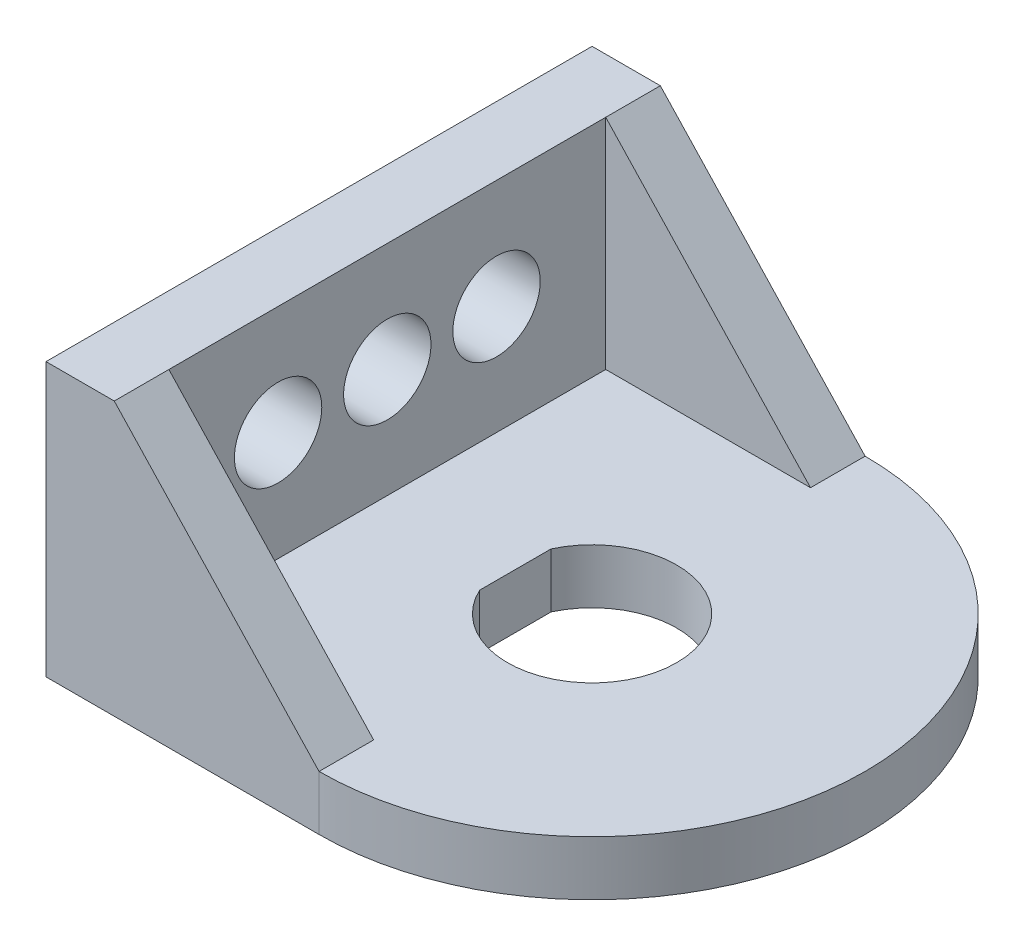
ISO-10303-21;
HEADER;
FILE_DESCRIPTION(('STEP AP214'),'2;1');
FILE_NAME('part.step','',(''),(''),'','','');
FILE_SCHEMA(('AUTOMOTIVE_DESIGN { 1 0 10303 214 1 1 1 1 }'));
ENDSEC;
DATA;
#1=APPLICATION_CONTEXT('core data for automotive mechanical design processes');
#2=APPLICATION_PROTOCOL_DEFINITION('international standard','automotive_design',2000,#1);
#3=PRODUCT_CONTEXT('',#1,'mechanical');
#4=PRODUCT('Part','Part','',(#3));
#5=PRODUCT_RELATED_PRODUCT_CATEGORY('part','',(#4));
#6=PRODUCT_DEFINITION_FORMATION('','',#4);
#7=PRODUCT_DEFINITION_CONTEXT('part definition',#1,'design');
#8=PRODUCT_DEFINITION('design','',#6,#7);
#9=PRODUCT_DEFINITION_SHAPE('','',#8);
#10=(LENGTH_UNIT() NAMED_UNIT(*) SI_UNIT(.MILLI.,.METRE.));
#11=(NAMED_UNIT(*) PLANE_ANGLE_UNIT() SI_UNIT($,.RADIAN.));
#12=(NAMED_UNIT(*) SI_UNIT($,.STERADIAN.) SOLID_ANGLE_UNIT());
#13=UNCERTAINTY_MEASURE_WITH_UNIT(LENGTH_MEASURE(1.E-05),#10,'distance_accuracy_value','');
#14=(GEOMETRIC_REPRESENTATION_CONTEXT(3) GLOBAL_UNCERTAINTY_ASSIGNED_CONTEXT((#13)) GLOBAL_UNIT_ASSIGNED_CONTEXT((#10,
#11,#12)) REPRESENTATION_CONTEXT('',''));
#15=CARTESIAN_POINT('',(0.,0.,0.));
#16=DIRECTION('',(0.,0.,1.));
#17=DIRECTION('',(1.,0.,0.));
#18=AXIS2_PLACEMENT_3D('',#15,#16,#17);
#19=CARTESIAN_POINT('',(0.,2.,0.));
#20=DIRECTION('',(0.,-1.,0.));
#21=DIRECTION('',(0.,0.,-1.));
#22=AXIS2_PLACEMENT_3D('',#19,#20,#21);
#23=CYLINDRICAL_SURFACE('',#22,3.1);
#24=CARTESIAN_POINT('',(0.,2.,0.));
#25=DIRECTION('',(0.,1.,0.));
#26=DIRECTION('',(0.,0.,1.));
#27=AXIS2_PLACEMENT_3D('',#24,#25,#26);
#28=CIRCLE('',#27,3.1);
#29=CARTESIAN_POINT('',(-2.81,2.,1.30916003605365));
#30=VERTEX_POINT('',#29);
#31=CARTESIAN_POINT('',(-2.81,2.,-1.30916003605365));
#32=VERTEX_POINT('',#31);
#33=EDGE_CURVE('E137',#30,#32,#28,.T.);
#34=ORIENTED_EDGE('',*,*,#33,.T.);
#35=DIRECTION('',(0.,1.,0.));
#36=VECTOR('',#35,1.);
#37=CARTESIAN_POINT('',(-2.81,-2.6343310346272,-1.30916003605365));
#38=LINE('',#37,#36);
#39=CARTESIAN_POINT('',(-2.81,0.,-1.30916003605365));
#40=VERTEX_POINT('',#39);
#41=EDGE_CURVE('E123',#40,#32,#38,.T.);
#42=ORIENTED_EDGE('',*,*,#41,.F.);
#43=CARTESIAN_POINT('',(0.,0.,0.));
#44=DIRECTION('',(0.,1.,0.));
#45=DIRECTION('',(0.,0.,1.));
#46=AXIS2_PLACEMENT_3D('',#43,#44,#45);
#47=CIRCLE('',#46,3.1);
#48=CARTESIAN_POINT('',(-2.81,0.,1.30916003605365));
#49=VERTEX_POINT('',#48);
#50=EDGE_CURVE('E149',#49,#40,#47,.T.);
#51=ORIENTED_EDGE('',*,*,#50,.F.);
#52=DIRECTION('',(0.,1.,0.));
#53=VECTOR('',#52,1.);
#54=CARTESIAN_POINT('',(-2.81,-2.6343310346272,1.30916003605365));
#55=LINE('',#54,#53);
#56=EDGE_CURVE('E63',#49,#30,#55,.T.);
#57=ORIENTED_EDGE('',*,*,#56,.T.);
#58=EDGE_LOOP('',(#34,#42,#51,#57));
#59=FACE_BOUND('',#58,.T.);
#60=ADVANCED_FACE('F45',(#59),#23,.F.);
#61=CARTESIAN_POINT('',(-7.5,10.,0.));
#62=DIRECTION('',(1.,0.,0.));
#63=DIRECTION('',(0.,0.,-1.));
#64=AXIS2_PLACEMENT_3D('',#61,#62,#63);
#65=PLANE('',#64);
#66=CARTESIAN_POINT('',(-7.5,6.,-4.));
#67=DIRECTION('',(1.,0.,0.));
#68=DIRECTION('',(0.,0.,-1.));
#69=AXIS2_PLACEMENT_3D('',#66,#67,#68);
#70=CIRCLE('',#69,1.6);
#71=CARTESIAN_POINT('',(-7.5,6.,-5.6));
#72=VERTEX_POINT('',#71);
#73=EDGE_CURVE('E260',#72,#72,#70,.T.);
#74=ORIENTED_EDGE('',*,*,#73,.F.);
#75=EDGE_LOOP('',(#74));
#76=FACE_BOUND('',#75,.T.);
#77=CARTESIAN_POINT('',(-7.5,6.,4.));
#78=DIRECTION('',(1.,0.,0.));
#79=DIRECTION('',(0.,0.,-1.));
#80=AXIS2_PLACEMENT_3D('',#77,#78,#79);
#81=CIRCLE('',#80,1.6);
#82=CARTESIAN_POINT('',(-7.5,6.,2.4));
#83=VERTEX_POINT('',#82);
#84=EDGE_CURVE('E259',#83,#83,#81,.T.);
#85=ORIENTED_EDGE('',*,*,#84,.F.);
#86=EDGE_LOOP('',(#85));
#87=FACE_BOUND('',#86,.T.);
#88=CARTESIAN_POINT('',(-7.5,6.,0.));
#89=DIRECTION('',(1.,0.,0.));
#90=DIRECTION('',(0.,0.,-1.));
#91=AXIS2_PLACEMENT_3D('',#88,#89,#90);
#92=CIRCLE('',#91,1.6);
#93=CARTESIAN_POINT('',(-7.5,6.,-1.6));
#94=VERTEX_POINT('',#93);
#95=EDGE_CURVE('E179',#94,#94,#92,.T.);
#96=ORIENTED_EDGE('',*,*,#95,.F.);
#97=EDGE_LOOP('',(#96));
#98=FACE_BOUND('',#97,.T.);
#99=DIRECTION('',(0.,0.,-1.));
#100=VECTOR('',#99,1.);
#101=CARTESIAN_POINT('',(-7.5,2.,0.));
#102=LINE('',#101,#100);
#103=CARTESIAN_POINT('',(-7.5,2.,8.));
#104=VERTEX_POINT('',#103);
#105=CARTESIAN_POINT('',(-7.5,2.,-8.));
#106=VERTEX_POINT('',#105);
#107=EDGE_CURVE('E158',#104,#106,#102,.T.);
#108=ORIENTED_EDGE('',*,*,#107,.T.);
#109=DIRECTION('',(0.,1.,0.));
#110=VECTOR('',#109,1.);
#111=CARTESIAN_POINT('',(-7.5,10.,-8.));
#112=LINE('',#111,#110);
#113=CARTESIAN_POINT('',(-7.5,10.,-8.));
#114=VERTEX_POINT('',#113);
#115=EDGE_CURVE('E196',#106,#114,#112,.T.);
#116=ORIENTED_EDGE('',*,*,#115,.T.);
#117=DIRECTION('',(0.,0.,1.));
#118=VECTOR('',#117,1.);
#119=CARTESIAN_POINT('',(-7.5,10.,0.));
#120=LINE('',#119,#118);
#121=CARTESIAN_POINT('',(-7.5,10.,8.));
#122=VERTEX_POINT('',#121);
#123=EDGE_CURVE('E223',#114,#122,#120,.T.);
#124=ORIENTED_EDGE('',*,*,#123,.T.);
#125=DIRECTION('',(0.,-1.,0.));
#126=VECTOR('',#125,1.);
#127=CARTESIAN_POINT('',(-7.5,2.,8.));
#128=LINE('',#127,#126);
#129=EDGE_CURVE('E205',#122,#104,#128,.T.);
#130=ORIENTED_EDGE('',*,*,#129,.T.);
#131=EDGE_LOOP('',(#108,#116,#124,#130));
#132=FACE_BOUND('',#131,.T.);
#133=ADVANCED_FACE('F246',(#76,#87,#98,#132),#65,.T.);
#134=CARTESIAN_POINT('',(-10.,2.,0.));
#135=DIRECTION('',(1.,0.,0.));
#136=DIRECTION('',(0.,0.,-1.));
#137=AXIS2_PLACEMENT_3D('',#134,#135,#136);
#138=PLANE('',#137);
#139=CARTESIAN_POINT('',(-10.,6.,-4.));
#140=DIRECTION('',(1.,0.,0.));
#141=DIRECTION('',(0.,0.,-1.));
#142=AXIS2_PLACEMENT_3D('',#139,#140,#141);
#143=CIRCLE('',#142,1.6);
#144=CARTESIAN_POINT('',(-10.,6.,-5.6));
#145=VERTEX_POINT('',#144);
#146=EDGE_CURVE('E49',#145,#145,#143,.T.);
#147=ORIENTED_EDGE('',*,*,#146,.T.);
#148=EDGE_LOOP('',(#147));
#149=FACE_BOUND('',#148,.T.);
#150=CARTESIAN_POINT('',(-10.,6.,4.));
#151=DIRECTION('',(1.,0.,0.));
#152=DIRECTION('',(0.,0.,-1.));
#153=AXIS2_PLACEMENT_3D('',#150,#151,#152);
#154=CIRCLE('',#153,1.6);
#155=CARTESIAN_POINT('',(-10.,6.,2.4));
#156=VERTEX_POINT('',#155);
#157=EDGE_CURVE('E178',#156,#156,#154,.T.);
#158=ORIENTED_EDGE('',*,*,#157,.T.);
#159=EDGE_LOOP('',(#158));
#160=FACE_BOUND('',#159,.T.);
#161=CARTESIAN_POINT('',(-10.,6.,0.));
#162=DIRECTION('',(1.,0.,0.));
#163=DIRECTION('',(0.,0.,-1.));
#164=AXIS2_PLACEMENT_3D('',#161,#162,#163);
#165=CIRCLE('',#164,1.6);
#166=CARTESIAN_POINT('',(-10.,6.,-1.6));
#167=VERTEX_POINT('',#166);
#168=EDGE_CURVE('E175',#167,#167,#165,.T.);
#169=ORIENTED_EDGE('',*,*,#168,.T.);
#170=EDGE_LOOP('',(#169));
#171=FACE_BOUND('',#170,.T.);
#172=DIRECTION('',(0.,0.,1.));
#173=VECTOR('',#172,1.);
#174=CARTESIAN_POINT('',(-10.,0.,0.));
#175=LINE('',#174,#173);
#176=CARTESIAN_POINT('',(-10.,0.,-10.));
#177=VERTEX_POINT('',#176);
#178=CARTESIAN_POINT('',(-10.,0.,10.));
#179=VERTEX_POINT('',#178);
#180=EDGE_CURVE('E153',#177,#179,#175,.T.);
#181=ORIENTED_EDGE('',*,*,#180,.T.);
#182=DIRECTION('',(0.,-1.,0.));
#183=VECTOR('',#182,1.);
#184=CARTESIAN_POINT('',(-10.,2.,10.));
#185=LINE('',#184,#183);
#186=CARTESIAN_POINT('',(-10.,10.,10.));
#187=VERTEX_POINT('',#186);
#188=EDGE_CURVE('E11',#187,#179,#185,.T.);
#189=ORIENTED_EDGE('',*,*,#188,.F.);
#190=DIRECTION('',(0.,0.,1.));
#191=VECTOR('',#190,1.);
#192=CARTESIAN_POINT('',(-10.,10.,0.));
#193=LINE('',#192,#191);
#194=CARTESIAN_POINT('',(-10.,10.,-10.));
#195=VERTEX_POINT('',#194);
#196=EDGE_CURVE('E234',#195,#187,#193,.T.);
#197=ORIENTED_EDGE('',*,*,#196,.F.);
#198=DIRECTION('',(0.,-1.,0.));
#199=VECTOR('',#198,1.);
#200=CARTESIAN_POINT('',(-10.,2.,-10.));
#201=LINE('',#200,#199);
#202=EDGE_CURVE('E141',#195,#177,#201,.T.);
#203=ORIENTED_EDGE('',*,*,#202,.T.);
#204=EDGE_LOOP('',(#181,#189,#197,#203));
#205=FACE_BOUND('',#204,.T.);
#206=ADVANCED_FACE('F47',(#149,#160,#171,#205),#138,.F.);
#207=CARTESIAN_POINT('',(0.,2.,10.));
#208=DIRECTION('',(0.,0.,-1.));
#209=DIRECTION('',(-1.,0.,0.));
#210=AXIS2_PLACEMENT_3D('',#207,#208,#209);
#211=PLANE('',#210);
#212=DIRECTION('',(0.,-1.,0.));
#213=VECTOR('',#212,1.);
#214=CARTESIAN_POINT('',(0.,2.,10.));
#215=LINE('',#214,#213);
#216=CARTESIAN_POINT('',(0.,2.,10.));
#217=VERTEX_POINT('',#216);
#218=CARTESIAN_POINT('',(0.,0.,10.));
#219=VERTEX_POINT('',#218);
#220=EDGE_CURVE('E55',#217,#219,#215,.T.);
#221=ORIENTED_EDGE('',*,*,#220,.F.);
#222=DIRECTION('',(-0.68394112888133,0.729537204140085,0.));
#223=VECTOR('',#222,1.);
#224=CARTESIAN_POINT('',(-7.5,10.,10.));
#225=LINE('',#224,#223);
#226=CARTESIAN_POINT('',(-7.5,10.,10.));
#227=VERTEX_POINT('',#226);
#228=EDGE_CURVE('E204',#217,#227,#225,.T.);
#229=ORIENTED_EDGE('',*,*,#228,.T.);
#230=DIRECTION('',(1.,0.,0.));
#231=VECTOR('',#230,1.);
#232=CARTESIAN_POINT('',(0.,10.,10.));
#233=LINE('',#232,#231);
#234=EDGE_CURVE('E238',#187,#227,#233,.T.);
#235=ORIENTED_EDGE('',*,*,#234,.F.);
#236=ORIENTED_EDGE('',*,*,#188,.T.);
#237=DIRECTION('',(1.,0.,0.));
#238=VECTOR('',#237,1.);
#239=CARTESIAN_POINT('',(0.,0.,10.));
#240=LINE('',#239,#238);
#241=EDGE_CURVE('E157',#179,#219,#240,.T.);
#242=ORIENTED_EDGE('',*,*,#241,.T.);
#243=EDGE_LOOP('',(#221,#229,#235,#236,#242));
#244=FACE_BOUND('',#243,.T.);
#245=ADVANCED_FACE('F289',(#244),#211,.F.);
#246=CARTESIAN_POINT('',(0.,2.,0.));
#247=DIRECTION('',(0.,-1.,0.));
#248=DIRECTION('',(0.,0.,-1.));
#249=AXIS2_PLACEMENT_3D('',#246,#247,#248);
#250=CYLINDRICAL_SURFACE('',#249,10.);
#251=CARTESIAN_POINT('',(0.,0.,0.));
#252=DIRECTION('',(0.,1.,0.));
#253=DIRECTION('',(0.,0.,1.));
#254=AXIS2_PLACEMENT_3D('',#251,#252,#253);
#255=CIRCLE('',#254,10.);
#256=CARTESIAN_POINT('',(0.,0.,-10.));
#257=VERTEX_POINT('',#256);
#258=EDGE_CURVE('E161',#219,#257,#255,.T.);
#259=ORIENTED_EDGE('',*,*,#258,.T.);
#260=DIRECTION('',(0.,-1.,0.));
#261=VECTOR('',#260,1.);
#262=CARTESIAN_POINT('',(0.,2.,-10.));
#263=LINE('',#262,#261);
#264=CARTESIAN_POINT('',(0.,2.,-10.));
#265=VERTEX_POINT('',#264);
#266=EDGE_CURVE('E147',#265,#257,#263,.T.);
#267=ORIENTED_EDGE('',*,*,#266,.F.);
#268=CARTESIAN_POINT('',(0.,2.,0.));
#269=DIRECTION('',(0.,1.,0.));
#270=DIRECTION('',(0.,0.,1.));
#271=AXIS2_PLACEMENT_3D('',#268,#269,#270);
#272=CIRCLE('',#271,10.);
#273=EDGE_CURVE('E142',#217,#265,#272,.T.);
#274=ORIENTED_EDGE('',*,*,#273,.F.);
#275=ORIENTED_EDGE('',*,*,#220,.T.);
#276=EDGE_LOOP('',(#259,#267,#274,#275));
#277=FACE_BOUND('',#276,.T.);
#278=ADVANCED_FACE('F314',(#277),#250,.T.);
#279=CARTESIAN_POINT('',(0.,2.,-10.));
#280=DIRECTION('',(0.,0.,1.));
#281=DIRECTION('',(1.,0.,0.));
#282=AXIS2_PLACEMENT_3D('',#279,#280,#281);
#283=PLANE('',#282);
#284=DIRECTION('',(-1.,0.,0.));
#285=VECTOR('',#284,1.);
#286=CARTESIAN_POINT('',(0.,0.,-10.));
#287=LINE('',#286,#285);
#288=EDGE_CURVE('E164',#257,#177,#287,.T.);
#289=ORIENTED_EDGE('',*,*,#288,.T.);
#290=ORIENTED_EDGE('',*,*,#202,.F.);
#291=DIRECTION('',(-1.,0.,0.));
#292=VECTOR('',#291,1.);
#293=CARTESIAN_POINT('',(0.,10.,-10.));
#294=LINE('',#293,#292);
#295=CARTESIAN_POINT('',(-7.5,10.,-10.));
#296=VERTEX_POINT('',#295);
#297=EDGE_CURVE('E230',#296,#195,#294,.T.);
#298=ORIENTED_EDGE('',*,*,#297,.F.);
#299=DIRECTION('',(0.68394112888133,-0.729537204140085,0.));
#300=VECTOR('',#299,1.);
#301=CARTESIAN_POINT('',(0.,2.,-10.));
#302=LINE('',#301,#300);
#303=EDGE_CURVE('E186',#296,#265,#302,.T.);
#304=ORIENTED_EDGE('',*,*,#303,.T.);
#305=ORIENTED_EDGE('',*,*,#266,.T.);
#306=EDGE_LOOP('',(#289,#290,#298,#304,#305));
#307=FACE_BOUND('',#306,.T.);
#308=ADVANCED_FACE('F318',(#307),#283,.F.);
#309=CARTESIAN_POINT('',(0.,2.,0.));
#310=DIRECTION('',(0.,1.,0.));
#311=DIRECTION('',(0.,0.,1.));
#312=AXIS2_PLACEMENT_3D('',#309,#310,#311);
#313=PLANE('',#312);
#314=DIRECTION('',(0.,0.,-1.));
#315=VECTOR('',#314,1.);
#316=CARTESIAN_POINT('',(0.,2.,-8.));
#317=LINE('',#316,#315);
#318=CARTESIAN_POINT('',(0.,2.,-8.));
#319=VERTEX_POINT('',#318);
#320=EDGE_CURVE('E71',#319,#265,#317,.T.);
#321=ORIENTED_EDGE('',*,*,#320,.F.);
#322=DIRECTION('',(-1.,0.,0.));
#323=VECTOR('',#322,1.);
#324=CARTESIAN_POINT('',(-7.5,2.,-8.));
#325=LINE('',#324,#323);
#326=EDGE_CURVE('E191',#319,#106,#325,.T.);
#327=ORIENTED_EDGE('',*,*,#326,.T.);
#328=ORIENTED_EDGE('',*,*,#107,.F.);
#329=DIRECTION('',(1.,0.,0.));
#330=VECTOR('',#329,1.);
#331=CARTESIAN_POINT('',(0.,2.,8.));
#332=LINE('',#331,#330);
#333=CARTESIAN_POINT('',(0.,2.,8.));
#334=VERTEX_POINT('',#333);
#335=EDGE_CURVE('E208',#104,#334,#332,.T.);
#336=ORIENTED_EDGE('',*,*,#335,.T.);
#337=DIRECTION('',(0.,0.,1.));
#338=VECTOR('',#337,1.);
#339=CARTESIAN_POINT('',(0.,2.,8.));
#340=LINE('',#339,#338);
#341=EDGE_CURVE('E215',#334,#217,#340,.T.);
#342=ORIENTED_EDGE('',*,*,#341,.T.);
#343=ORIENTED_EDGE('',*,*,#273,.T.);
#344=EDGE_LOOP('',(#321,#327,#328,#336,#342,#343));
#345=FACE_BOUND('',#344,.T.);
#346=ORIENTED_EDGE('',*,*,#33,.F.);
#347=DIRECTION('',(0.,0.,1.));
#348=VECTOR('',#347,1.);
#349=CARTESIAN_POINT('',(-2.81,2.,0.));
#350=LINE('',#349,#348);
#351=EDGE_CURVE('E126',#32,#30,#350,.T.);
#352=ORIENTED_EDGE('',*,*,#351,.F.);
#353=EDGE_LOOP('',(#346,#352));
#354=FACE_BOUND('',#353,.T.);
#355=ADVANCED_FACE('F136',(#345,#354),#313,.T.);
#356=CARTESIAN_POINT('',(0.,0.,0.));
#357=DIRECTION('',(0.,1.,0.));
#358=DIRECTION('',(0.,0.,1.));
#359=AXIS2_PLACEMENT_3D('',#356,#357,#358);
#360=PLANE('',#359);
#361=ORIENTED_EDGE('',*,*,#258,.F.);
#362=ORIENTED_EDGE('',*,*,#241,.F.);
#363=ORIENTED_EDGE('',*,*,#180,.F.);
#364=ORIENTED_EDGE('',*,*,#288,.F.);
#365=EDGE_LOOP('',(#361,#362,#363,#364));
#366=FACE_BOUND('',#365,.T.);
#367=ORIENTED_EDGE('',*,*,#50,.T.);
#368=DIRECTION('',(0.,0.,-1.));
#369=VECTOR('',#368,1.);
#370=CARTESIAN_POINT('',(-2.81,0.,0.));
#371=LINE('',#370,#369);
#372=EDGE_CURVE('E127',#49,#40,#371,.T.);
#373=ORIENTED_EDGE('',*,*,#372,.F.);
#374=EDGE_LOOP('',(#367,#373));
#375=FACE_BOUND('',#374,.T.);
#376=ADVANCED_FACE('F295',(#366,#375),#360,.F.);
#377=CARTESIAN_POINT('',(0.,10.,0.));
#378=DIRECTION('',(0.,1.,0.));
#379=DIRECTION('',(0.,0.,1.));
#380=AXIS2_PLACEMENT_3D('',#377,#378,#379);
#381=PLANE('',#380);
#382=EDGE_CURVE('E226',#296,#114,#120,.T.);
#383=ORIENTED_EDGE('',*,*,#382,.F.);
#384=ORIENTED_EDGE('',*,*,#297,.T.);
#385=ORIENTED_EDGE('',*,*,#196,.T.);
#386=ORIENTED_EDGE('',*,*,#234,.T.);
#387=DIRECTION('',(0.,0.,1.));
#388=VECTOR('',#387,1.);
#389=CARTESIAN_POINT('',(-7.5,10.,8.));
#390=LINE('',#389,#388);
#391=EDGE_CURVE('E219',#122,#227,#390,.T.);
#392=ORIENTED_EDGE('',*,*,#391,.F.);
#393=ORIENTED_EDGE('',*,*,#123,.F.);
#394=EDGE_LOOP('',(#383,#384,#385,#386,#392,#393));
#395=FACE_BOUND('',#394,.T.);
#396=ADVANCED_FACE('F304',(#395),#381,.T.);
#397=CARTESIAN_POINT('',(-7.5,10.,8.));
#398=DIRECTION('',(0.729537204140085,0.68394112888133,0.));
#399=DIRECTION('',(-0.68394112888133,0.729537204140085,0.));
#400=AXIS2_PLACEMENT_3D('',#397,#398,#399);
#401=PLANE('',#400);
#402=ORIENTED_EDGE('',*,*,#228,.F.);
#403=ORIENTED_EDGE('',*,*,#341,.F.);
#404=DIRECTION('',(-0.68394112888133,0.729537204140085,0.));
#405=VECTOR('',#404,1.);
#406=CARTESIAN_POINT('',(-7.5,10.,8.));
#407=LINE('',#406,#405);
#408=EDGE_CURVE('E211',#334,#122,#407,.T.);
#409=ORIENTED_EDGE('',*,*,#408,.T.);
#410=ORIENTED_EDGE('',*,*,#391,.T.);
#411=EDGE_LOOP('',(#402,#403,#409,#410));
#412=FACE_BOUND('',#411,.T.);
#413=ADVANCED_FACE('F306',(#412),#401,.T.);
#414=CARTESIAN_POINT('',(0.,0.,8.));
#415=DIRECTION('',(0.,0.,1.));
#416=DIRECTION('',(1.,0.,0.));
#417=AXIS2_PLACEMENT_3D('',#414,#415,#416);
#418=PLANE('',#417);
#419=ORIENTED_EDGE('',*,*,#129,.F.);
#420=ORIENTED_EDGE('',*,*,#408,.F.);
#421=ORIENTED_EDGE('',*,*,#335,.F.);
#422=EDGE_LOOP('',(#419,#420,#421));
#423=FACE_BOUND('',#422,.T.);
#424=ADVANCED_FACE('F310',(#423),#418,.F.);
#425=CARTESIAN_POINT('',(0.,2.,-8.));
#426=DIRECTION('',(0.729537204140085,0.68394112888133,0.));
#427=DIRECTION('',(-0.68394112888133,0.729537204140085,0.));
#428=AXIS2_PLACEMENT_3D('',#425,#426,#427);
#429=PLANE('',#428);
#430=ORIENTED_EDGE('',*,*,#303,.F.);
#431=ORIENTED_EDGE('',*,*,#382,.T.);
#432=DIRECTION('',(0.68394112888133,-0.729537204140085,0.));
#433=VECTOR('',#432,1.);
#434=CARTESIAN_POINT('',(0.,2.,-8.));
#435=LINE('',#434,#433);
#436=EDGE_CURVE('E200',#114,#319,#435,.T.);
#437=ORIENTED_EDGE('',*,*,#436,.T.);
#438=ORIENTED_EDGE('',*,*,#320,.T.);
#439=EDGE_LOOP('',(#430,#431,#437,#438));
#440=FACE_BOUND('',#439,.T.);
#441=ADVANCED_FACE('F316',(#440),#429,.T.);
#442=CARTESIAN_POINT('',(0.,0.,-8.));
#443=DIRECTION('',(0.,0.,-1.));
#444=DIRECTION('',(-1.,0.,0.));
#445=AXIS2_PLACEMENT_3D('',#442,#443,#444);
#446=PLANE('',#445);
#447=ORIENTED_EDGE('',*,*,#326,.F.);
#448=ORIENTED_EDGE('',*,*,#436,.F.);
#449=ORIENTED_EDGE('',*,*,#115,.F.);
#450=EDGE_LOOP('',(#447,#448,#449));
#451=FACE_BOUND('',#450,.T.);
#452=ADVANCED_FACE('F251',(#451),#446,.F.);
#453=CARTESIAN_POINT('',(-12.5,6.,0.));
#454=DIRECTION('',(1.,0.,0.));
#455=DIRECTION('',(0.,0.,-1.));
#456=AXIS2_PLACEMENT_3D('',#453,#454,#455);
#457=CYLINDRICAL_SURFACE('',#456,1.6);
#458=ORIENTED_EDGE('',*,*,#95,.T.);
#459=EDGE_LOOP('',(#458));
#460=FACE_BOUND('',#459,.T.);
#461=ORIENTED_EDGE('',*,*,#168,.F.);
#462=EDGE_LOOP('',(#461));
#463=FACE_BOUND('',#462,.T.);
#464=ADVANCED_FACE('F281',(#460,#463),#457,.F.);
#465=CARTESIAN_POINT('',(-12.5,6.,4.));
#466=DIRECTION('',(1.,0.,0.));
#467=DIRECTION('',(0.,0.,-1.));
#468=AXIS2_PLACEMENT_3D('',#465,#466,#467);
#469=CYLINDRICAL_SURFACE('',#468,1.6);
#470=ORIENTED_EDGE('',*,*,#84,.T.);
#471=EDGE_LOOP('',(#470));
#472=FACE_BOUND('',#471,.T.);
#473=ORIENTED_EDGE('',*,*,#157,.F.);
#474=EDGE_LOOP('',(#473));
#475=FACE_BOUND('',#474,.T.);
#476=ADVANCED_FACE('F272',(#472,#475),#469,.F.);
#477=CARTESIAN_POINT('',(-12.5,6.,-4.));
#478=DIRECTION('',(1.,0.,0.));
#479=DIRECTION('',(0.,0.,-1.));
#480=AXIS2_PLACEMENT_3D('',#477,#478,#479);
#481=CYLINDRICAL_SURFACE('',#480,1.6);
#482=ORIENTED_EDGE('',*,*,#73,.T.);
#483=EDGE_LOOP('',(#482));
#484=FACE_BOUND('',#483,.T.);
#485=ORIENTED_EDGE('',*,*,#146,.F.);
#486=EDGE_LOOP('',(#485));
#487=FACE_BOUND('',#486,.T.);
#488=ADVANCED_FACE('F346',(#484,#487),#481,.F.);
#489=CARTESIAN_POINT('',(-2.81,-2.6343310346272,0.));
#490=DIRECTION('',(-1.,0.,0.));
#491=DIRECTION('',(0.,0.,1.));
#492=AXIS2_PLACEMENT_3D('',#489,#490,#491);
#493=PLANE('',#492);
#494=ORIENTED_EDGE('',*,*,#56,.F.);
#495=ORIENTED_EDGE('',*,*,#372,.T.);
#496=ORIENTED_EDGE('',*,*,#41,.T.);
#497=ORIENTED_EDGE('',*,*,#351,.T.);
#498=EDGE_LOOP('',(#494,#495,#496,#497));
#499=FACE_BOUND('',#498,.T.);
#500=ADVANCED_FACE('F125',(#499),#493,.F.);
#501=CLOSED_SHELL('',(#60,#133,#206,#245,#278,#308,#355,#376,#396,#413,#424,#441,#452,#464,#476,
#488,#500));
#502=MANIFOLD_SOLID_BREP('B2',#501);
#503=ADVANCED_BREP_SHAPE_REPRESENTATION('',(#18,#502),#14);
#504=SHAPE_DEFINITION_REPRESENTATION(#9,#503);
ENDSEC;
END-ISO-10303-21;
